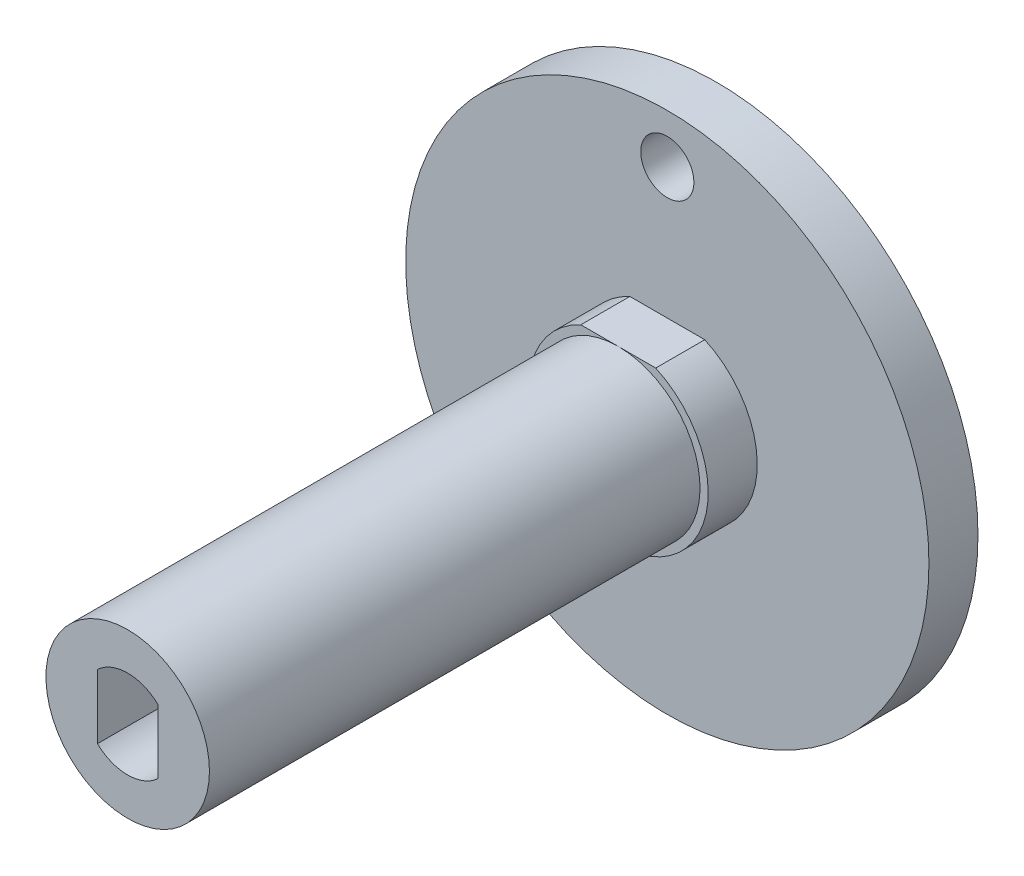
ISO-10303-21;
HEADER;
FILE_DESCRIPTION(('STEP AP214'),'2;1');
FILE_NAME('part.step','',(''),(''),'','','');
FILE_SCHEMA(('AUTOMOTIVE_DESIGN { 1 0 10303 214 1 1 1 1 }'));
ENDSEC;
DATA;
#1=APPLICATION_CONTEXT('core data for automotive mechanical design processes');
#2=APPLICATION_PROTOCOL_DEFINITION('international standard','automotive_design',2000,#1);
#3=PRODUCT_CONTEXT('',#1,'mechanical');
#4=PRODUCT('Part','Part','',(#3));
#5=PRODUCT_RELATED_PRODUCT_CATEGORY('part','',(#4));
#6=PRODUCT_DEFINITION_FORMATION('','',#4);
#7=PRODUCT_DEFINITION_CONTEXT('part definition',#1,'design');
#8=PRODUCT_DEFINITION('design','',#6,#7);
#9=PRODUCT_DEFINITION_SHAPE('','',#8);
#10=(LENGTH_UNIT() NAMED_UNIT(*) SI_UNIT(.MILLI.,.METRE.));
#11=(NAMED_UNIT(*) PLANE_ANGLE_UNIT() SI_UNIT($,.RADIAN.));
#12=(NAMED_UNIT(*) SI_UNIT($,.STERADIAN.) SOLID_ANGLE_UNIT());
#13=UNCERTAINTY_MEASURE_WITH_UNIT(LENGTH_MEASURE(1.E-05),#10,'distance_accuracy_value','');
#14=(GEOMETRIC_REPRESENTATION_CONTEXT(3) GLOBAL_UNCERTAINTY_ASSIGNED_CONTEXT((#13)) GLOBAL_UNIT_ASSIGNED_CONTEXT((#10,
#11,#12)) REPRESENTATION_CONTEXT('',''));
#15=CARTESIAN_POINT('',(0.,0.,0.));
#16=DIRECTION('',(0.,0.,1.));
#17=DIRECTION('',(1.,0.,0.));
#18=AXIS2_PLACEMENT_3D('',#15,#16,#17);
#19=CARTESIAN_POINT('',(0.,0.,3.));
#20=DIRECTION('',(0.,0.,1.));
#21=DIRECTION('',(1.,0.,0.));
#22=AXIS2_PLACEMENT_3D('',#19,#20,#21);
#23=PLANE('',#22);
#24=CARTESIAN_POINT('',(0.,0.,3.));
#25=DIRECTION('',(0.,0.,1.));
#26=DIRECTION('',(1.,0.,0.));
#27=AXIS2_PLACEMENT_3D('',#24,#25,#26);
#28=CIRCLE('',#27,5.5);
#29=CARTESIAN_POINT('',(-2.29128784747792,5.,3.));
#30=VERTEX_POINT('',#29);
#31=CARTESIAN_POINT('',(2.29128784747792,5.,3.));
#32=VERTEX_POINT('',#31);
#33=EDGE_CURVE('E135',#30,#32,#28,.T.);
#34=ORIENTED_EDGE('',*,*,#33,.F.);
#35=DIRECTION('',(-1.,0.,0.));
#36=VECTOR('',#35,1.);
#37=CARTESIAN_POINT('',(-2.29128784747792,5.,3.));
#38=LINE('',#37,#36);
#39=EDGE_CURVE('E59',#32,#30,#38,.T.);
#40=ORIENTED_EDGE('',*,*,#39,.F.);
#41=EDGE_LOOP('',(#34,#40));
#42=FACE_BOUND('',#41,.T.);
#43=CARTESIAN_POINT('',(0.,0.,3.));
#44=DIRECTION('',(0.,0.,1.));
#45=DIRECTION('',(1.,0.,0.));
#46=AXIS2_PLACEMENT_3D('',#43,#44,#45);
#47=CIRCLE('',#46,16.);
#48=CARTESIAN_POINT('',(16.,0.,3.));
#49=VERTEX_POINT('',#48);
#50=EDGE_CURVE('E11',#49,#49,#47,.T.);
#51=ORIENTED_EDGE('',*,*,#50,.T.);
#52=EDGE_LOOP('',(#51));
#53=FACE_BOUND('',#52,.T.);
#54=CARTESIAN_POINT('',(0.,13.,3.));
#55=DIRECTION('',(0.,0.,1.));
#56=DIRECTION('',(1.,0.,0.));
#57=AXIS2_PLACEMENT_3D('',#54,#55,#56);
#58=CIRCLE('',#57,1.625);
#59=CARTESIAN_POINT('',(1.625,13.,3.));
#60=VERTEX_POINT('',#59);
#61=EDGE_CURVE('E153',#60,#60,#58,.T.);
#62=ORIENTED_EDGE('',*,*,#61,.F.);
#63=EDGE_LOOP('',(#62));
#64=FACE_BOUND('',#63,.T.);
#65=ADVANCED_FACE('F37',(#42,#53,#64),#23,.T.);
#66=CARTESIAN_POINT('',(0.,0.,0.));
#67=DIRECTION('',(0.,0.,1.));
#68=DIRECTION('',(1.,0.,0.));
#69=AXIS2_PLACEMENT_3D('',#66,#67,#68);
#70=PLANE('',#69);
#71=CARTESIAN_POINT('',(0.,0.,0.));
#72=DIRECTION('',(0.,0.,1.));
#73=DIRECTION('',(1.,0.,0.));
#74=AXIS2_PLACEMENT_3D('',#71,#72,#73);
#75=CIRCLE('',#74,16.);
#76=CARTESIAN_POINT('',(16.,0.,0.));
#77=VERTEX_POINT('',#76);
#78=EDGE_CURVE('E41',#77,#77,#75,.T.);
#79=ORIENTED_EDGE('',*,*,#78,.F.);
#80=EDGE_LOOP('',(#79));
#81=FACE_BOUND('',#80,.T.);
#82=CARTESIAN_POINT('',(0.,13.,0.));
#83=DIRECTION('',(0.,0.,1.));
#84=DIRECTION('',(1.,0.,0.));
#85=AXIS2_PLACEMENT_3D('',#82,#83,#84);
#86=CIRCLE('',#85,1.625);
#87=CARTESIAN_POINT('',(1.625,13.,0.));
#88=VERTEX_POINT('',#87);
#89=EDGE_CURVE('E152',#88,#88,#86,.T.);
#90=ORIENTED_EDGE('',*,*,#89,.T.);
#91=EDGE_LOOP('',(#90));
#92=FACE_BOUND('',#91,.T.);
#93=ADVANCED_FACE('F159',(#81,#92),#70,.F.);
#94=CARTESIAN_POINT('',(0.,0.,3.));
#95=DIRECTION('',(0.,0.,-1.));
#96=DIRECTION('',(-1.,0.,0.));
#97=AXIS2_PLACEMENT_3D('',#94,#95,#96);
#98=CYLINDRICAL_SURFACE('',#97,16.);
#99=ORIENTED_EDGE('',*,*,#50,.F.);
#100=EDGE_LOOP('',(#99));
#101=FACE_BOUND('',#100,.T.);
#102=ORIENTED_EDGE('',*,*,#78,.T.);
#103=EDGE_LOOP('',(#102));
#104=FACE_BOUND('',#103,.T.);
#105=ADVANCED_FACE('F39',(#101,#104),#98,.T.);
#106=CARTESIAN_POINT('',(0.,13.,3.));
#107=DIRECTION('',(0.,0.,-1.));
#108=DIRECTION('',(-1.,0.,0.));
#109=AXIS2_PLACEMENT_3D('',#106,#107,#108);
#110=CYLINDRICAL_SURFACE('',#109,1.625);
#111=ORIENTED_EDGE('',*,*,#61,.T.);
#112=EDGE_LOOP('',(#111));
#113=FACE_BOUND('',#112,.T.);
#114=ORIENTED_EDGE('',*,*,#89,.F.);
#115=EDGE_LOOP('',(#114));
#116=FACE_BOUND('',#115,.T.);
#117=ADVANCED_FACE('F161',(#113,#116),#110,.F.);
#118=CARTESIAN_POINT('',(0.,0.,6.));
#119=DIRECTION('',(0.,0.,-1.));
#120=DIRECTION('',(-1.,0.,0.));
#121=AXIS2_PLACEMENT_3D('',#118,#119,#120);
#122=CYLINDRICAL_SURFACE('',#121,5.5);
#123=ORIENTED_EDGE('',*,*,#33,.T.);
#124=DIRECTION('',(0.,0.,-1.));
#125=VECTOR('',#124,1.);
#126=CARTESIAN_POINT('',(2.29128784747792,5.,6.));
#127=LINE('',#126,#125);
#128=CARTESIAN_POINT('',(2.29128784747792,5.,6.));
#129=VERTEX_POINT('',#128);
#130=EDGE_CURVE('E150',#129,#32,#127,.T.);
#131=ORIENTED_EDGE('',*,*,#130,.F.);
#132=CARTESIAN_POINT('',(0.,0.,6.));
#133=DIRECTION('',(0.,0.,1.));
#134=DIRECTION('',(1.,0.,0.));
#135=AXIS2_PLACEMENT_3D('',#132,#133,#134);
#136=CIRCLE('',#135,5.5);
#137=CARTESIAN_POINT('',(-2.29128784747792,5.,6.));
#138=VERTEX_POINT('',#137);
#139=EDGE_CURVE('E138',#138,#129,#136,.T.);
#140=ORIENTED_EDGE('',*,*,#139,.F.);
#141=DIRECTION('',(0.,0.,-1.));
#142=VECTOR('',#141,1.);
#143=CARTESIAN_POINT('',(-2.29128784747792,5.,6.));
#144=LINE('',#143,#142);
#145=EDGE_CURVE('E144',#138,#30,#144,.T.);
#146=ORIENTED_EDGE('',*,*,#145,.T.);
#147=EDGE_LOOP('',(#123,#131,#140,#146));
#148=FACE_BOUND('',#147,.T.);
#149=ADVANCED_FACE('F163',(#148),#122,.T.);
#150=CARTESIAN_POINT('',(-2.29128784747792,5.,6.));
#151=DIRECTION('',(0.,-1.,0.));
#152=DIRECTION('',(0.,0.,-1.));
#153=AXIS2_PLACEMENT_3D('',#150,#151,#152);
#154=PLANE('',#153);
#155=ORIENTED_EDGE('',*,*,#39,.T.);
#156=ORIENTED_EDGE('',*,*,#145,.F.);
#157=DIRECTION('',(-1.,0.,0.));
#158=VECTOR('',#157,1.);
#159=CARTESIAN_POINT('',(-2.29128784747792,5.,6.));
#160=LINE('',#159,#158);
#161=CARTESIAN_POINT('',(0.,5.,6.));
#162=VERTEX_POINT('',#161);
#163=EDGE_CURVE('E141',#162,#138,#160,.T.);
#164=ORIENTED_EDGE('',*,*,#163,.F.);
#165=EDGE_CURVE('E142',#129,#162,#160,.T.);
#166=ORIENTED_EDGE('',*,*,#165,.F.);
#167=ORIENTED_EDGE('',*,*,#130,.T.);
#168=EDGE_LOOP('',(#155,#156,#164,#166,#167));
#169=FACE_BOUND('',#168,.T.);
#170=ADVANCED_FACE('F170',(#169),#154,.F.);
#171=CARTESIAN_POINT('',(0.,0.,6.));
#172=DIRECTION('',(0.,0.,1.));
#173=DIRECTION('',(1.,0.,0.));
#174=AXIS2_PLACEMENT_3D('',#171,#172,#173);
#175=PLANE('',#174);
#176=ORIENTED_EDGE('',*,*,#165,.T.);
#177=CARTESIAN_POINT('',(0.,0.,6.));
#178=DIRECTION('',(0.,0.,1.));
#179=DIRECTION('',(1.,0.,0.));
#180=AXIS2_PLACEMENT_3D('',#177,#178,#179);
#181=CIRCLE('',#180,5.);
#182=EDGE_CURVE('E128',#162,#162,#181,.T.);
#183=ORIENTED_EDGE('',*,*,#182,.F.);
#184=ORIENTED_EDGE('',*,*,#163,.T.);
#185=ORIENTED_EDGE('',*,*,#139,.T.);
#186=EDGE_LOOP('',(#176,#183,#184,#185));
#187=FACE_BOUND('',#186,.T.);
#188=ADVANCED_FACE('F193',(#187),#175,.T.);
#189=CARTESIAN_POINT('',(0.,0.,36.));
#190=DIRECTION('',(0.,0.,-1.));
#191=DIRECTION('',(-1.,0.,0.));
#192=AXIS2_PLACEMENT_3D('',#189,#190,#191);
#193=CYLINDRICAL_SURFACE('',#192,5.);
#194=CARTESIAN_POINT('',(0.,0.,36.));
#195=DIRECTION('',(0.,0.,1.));
#196=DIRECTION('',(1.,0.,0.));
#197=AXIS2_PLACEMENT_3D('',#194,#195,#196);
#198=CIRCLE('',#197,5.);
#199=CARTESIAN_POINT('',(5.,0.,36.));
#200=VERTEX_POINT('',#199);
#201=EDGE_CURVE('E132',#200,#200,#198,.T.);
#202=ORIENTED_EDGE('',*,*,#201,.F.);
#203=EDGE_LOOP('',(#202));
#204=FACE_BOUND('',#203,.T.);
#205=ORIENTED_EDGE('',*,*,#182,.T.);
#206=EDGE_LOOP('',(#205));
#207=FACE_BOUND('',#206,.T.);
#208=ADVANCED_FACE('F196',(#204,#207),#193,.T.);
#209=CARTESIAN_POINT('',(0.,0.,36.));
#210=DIRECTION('',(0.,0.,1.));
#211=DIRECTION('',(1.,0.,0.));
#212=AXIS2_PLACEMENT_3D('',#209,#210,#211);
#213=PLANE('',#212);
#214=CARTESIAN_POINT('',(0.,0.,36.));
#215=DIRECTION('',(0.,0.,1.));
#216=DIRECTION('',(1.,0.,0.));
#217=AXIS2_PLACEMENT_3D('',#214,#215,#216);
#218=CIRCLE('',#217,2.7);
#219=CARTESIAN_POINT('',(-1.85,-1.96659604392971,36.));
#220=VERTEX_POINT('',#219);
#221=CARTESIAN_POINT('',(1.85,-1.96659604392971,36.));
#222=VERTEX_POINT('',#221);
#223=EDGE_CURVE('E52',#220,#222,#218,.T.);
#224=ORIENTED_EDGE('',*,*,#223,.F.);
#225=DIRECTION('',(0.,-1.,0.));
#226=VECTOR('',#225,1.);
#227=CARTESIAN_POINT('',(-1.85,-1.96659604392971,36.));
#228=LINE('',#227,#226);
#229=CARTESIAN_POINT('',(-1.85,1.96659604392971,36.));
#230=VERTEX_POINT('',#229);
#231=EDGE_CURVE('E113',#230,#220,#228,.T.);
#232=ORIENTED_EDGE('',*,*,#231,.F.);
#233=CARTESIAN_POINT('',(0.,0.,36.));
#234=DIRECTION('',(0.,0.,1.));
#235=DIRECTION('',(1.,0.,0.));
#236=AXIS2_PLACEMENT_3D('',#233,#234,#235);
#237=CIRCLE('',#236,2.7);
#238=CARTESIAN_POINT('',(1.85,1.96659604392971,36.));
#239=VERTEX_POINT('',#238);
#240=EDGE_CURVE('E116',#239,#230,#237,.T.);
#241=ORIENTED_EDGE('',*,*,#240,.F.);
#242=DIRECTION('',(0.,1.,0.));
#243=VECTOR('',#242,1.);
#244=CARTESIAN_POINT('',(1.85,-1.96659604392971,36.));
#245=LINE('',#244,#243);
#246=EDGE_CURVE('E122',#222,#239,#245,.T.);
#247=ORIENTED_EDGE('',*,*,#246,.F.);
#248=EDGE_LOOP('',(#224,#232,#241,#247));
#249=FACE_BOUND('',#248,.T.);
#250=ORIENTED_EDGE('',*,*,#201,.T.);
#251=EDGE_LOOP('',(#250));
#252=FACE_BOUND('',#251,.T.);
#253=ADVANCED_FACE('F198',(#249,#252),#213,.T.);
#254=CARTESIAN_POINT('',(0.,0.,28.));
#255=DIRECTION('',(0.,0.,1.));
#256=DIRECTION('',(1.,0.,0.));
#257=AXIS2_PLACEMENT_3D('',#254,#255,#256);
#258=CYLINDRICAL_SURFACE('',#257,2.7);
#259=ORIENTED_EDGE('',*,*,#223,.T.);
#260=DIRECTION('',(0.,0.,1.));
#261=VECTOR('',#260,1.);
#262=CARTESIAN_POINT('',(1.85,-1.96659604392971,28.));
#263=LINE('',#262,#261);
#264=CARTESIAN_POINT('',(1.85,-1.96659604392971,28.));
#265=VERTEX_POINT('',#264);
#266=EDGE_CURVE('E91',#265,#222,#263,.T.);
#267=ORIENTED_EDGE('',*,*,#266,.F.);
#268=CARTESIAN_POINT('',(0.,0.,28.));
#269=DIRECTION('',(0.,0.,1.));
#270=DIRECTION('',(1.,0.,0.));
#271=AXIS2_PLACEMENT_3D('',#268,#269,#270);
#272=CIRCLE('',#271,2.7);
#273=CARTESIAN_POINT('',(-1.85,-1.96659604392971,28.));
#274=VERTEX_POINT('',#273);
#275=EDGE_CURVE('E95',#274,#265,#272,.T.);
#276=ORIENTED_EDGE('',*,*,#275,.F.);
#277=DIRECTION('',(0.,0.,1.));
#278=VECTOR('',#277,1.);
#279=CARTESIAN_POINT('',(-1.85,-1.96659604392971,28.));
#280=LINE('',#279,#278);
#281=EDGE_CURVE('E126',#274,#220,#280,.T.);
#282=ORIENTED_EDGE('',*,*,#281,.T.);
#283=EDGE_LOOP('',(#259,#267,#276,#282));
#284=FACE_BOUND('',#283,.T.);
#285=ADVANCED_FACE('F93',(#284),#258,.F.);
#286=CARTESIAN_POINT('',(-1.85,-1.96659604392971,28.));
#287=DIRECTION('',(-1.,0.,0.));
#288=DIRECTION('',(0.,0.,1.));
#289=AXIS2_PLACEMENT_3D('',#286,#287,#288);
#290=PLANE('',#289);
#291=ORIENTED_EDGE('',*,*,#231,.T.);
#292=ORIENTED_EDGE('',*,*,#281,.F.);
#293=DIRECTION('',(0.,-1.,0.));
#294=VECTOR('',#293,1.);
#295=CARTESIAN_POINT('',(-1.85,-1.96659604392971,28.));
#296=LINE('',#295,#294);
#297=CARTESIAN_POINT('',(-1.85,1.96659604392971,28.));
#298=VERTEX_POINT('',#297);
#299=EDGE_CURVE('E101',#298,#274,#296,.T.);
#300=ORIENTED_EDGE('',*,*,#299,.F.);
#301=DIRECTION('',(0.,0.,1.));
#302=VECTOR('',#301,1.);
#303=CARTESIAN_POINT('',(-1.85,1.96659604392971,28.));
#304=LINE('',#303,#302);
#305=EDGE_CURVE('E129',#298,#230,#304,.T.);
#306=ORIENTED_EDGE('',*,*,#305,.T.);
#307=EDGE_LOOP('',(#291,#292,#300,#306));
#308=FACE_BOUND('',#307,.T.);
#309=ADVANCED_FACE('F242',(#308),#290,.F.);
#310=CARTESIAN_POINT('',(0.,0.,28.));
#311=DIRECTION('',(0.,0.,1.));
#312=DIRECTION('',(1.,0.,0.));
#313=AXIS2_PLACEMENT_3D('',#310,#311,#312);
#314=CYLINDRICAL_SURFACE('',#313,2.7);
#315=ORIENTED_EDGE('',*,*,#240,.T.);
#316=ORIENTED_EDGE('',*,*,#305,.F.);
#317=CARTESIAN_POINT('',(0.,0.,28.));
#318=DIRECTION('',(0.,0.,1.));
#319=DIRECTION('',(1.,0.,0.));
#320=AXIS2_PLACEMENT_3D('',#317,#318,#319);
#321=CIRCLE('',#320,2.7);
#322=CARTESIAN_POINT('',(1.85,1.96659604392971,28.));
#323=VERTEX_POINT('',#322);
#324=EDGE_CURVE('E109',#323,#298,#321,.T.);
#325=ORIENTED_EDGE('',*,*,#324,.F.);
#326=DIRECTION('',(0.,0.,1.));
#327=VECTOR('',#326,1.);
#328=CARTESIAN_POINT('',(1.85,1.96659604392971,28.));
#329=LINE('',#328,#327);
#330=EDGE_CURVE('E100',#323,#239,#329,.T.);
#331=ORIENTED_EDGE('',*,*,#330,.T.);
#332=EDGE_LOOP('',(#315,#316,#325,#331));
#333=FACE_BOUND('',#332,.T.);
#334=ADVANCED_FACE('F251',(#333),#314,.F.);
#335=CARTESIAN_POINT('',(1.85,-1.96659604392971,28.));
#336=DIRECTION('',(1.,0.,0.));
#337=DIRECTION('',(0.,0.,-1.));
#338=AXIS2_PLACEMENT_3D('',#335,#336,#337);
#339=PLANE('',#338);
#340=ORIENTED_EDGE('',*,*,#246,.T.);
#341=ORIENTED_EDGE('',*,*,#330,.F.);
#342=DIRECTION('',(0.,1.,0.));
#343=VECTOR('',#342,1.);
#344=CARTESIAN_POINT('',(1.85,-1.96659604392971,28.));
#345=LINE('',#344,#343);
#346=EDGE_CURVE('E104',#265,#323,#345,.T.);
#347=ORIENTED_EDGE('',*,*,#346,.F.);
#348=ORIENTED_EDGE('',*,*,#266,.T.);
#349=EDGE_LOOP('',(#340,#341,#347,#348));
#350=FACE_BOUND('',#349,.T.);
#351=ADVANCED_FACE('F105',(#350),#339,.F.);
#352=CARTESIAN_POINT('',(0.,0.,28.));
#353=DIRECTION('',(0.,0.,1.));
#354=DIRECTION('',(1.,0.,0.));
#355=AXIS2_PLACEMENT_3D('',#352,#353,#354);
#356=PLANE('',#355);
#357=ORIENTED_EDGE('',*,*,#275,.T.);
#358=ORIENTED_EDGE('',*,*,#346,.T.);
#359=ORIENTED_EDGE('',*,*,#324,.T.);
#360=ORIENTED_EDGE('',*,*,#299,.T.);
#361=EDGE_LOOP('',(#357,#358,#359,#360));
#362=FACE_BOUND('',#361,.T.);
#363=ADVANCED_FACE('F111',(#362),#356,.T.);
#364=CLOSED_SHELL('',(#65,#93,#105,#117,#149,#170,#188,#208,#253,#285,#309,#334,#351,#363));
#365=MANIFOLD_SOLID_BREP('B2',#364);
#366=ADVANCED_BREP_SHAPE_REPRESENTATION('',(#18,#365),#14);
#367=SHAPE_DEFINITION_REPRESENTATION(#9,#366);
ENDSEC;
END-ISO-10303-21;
